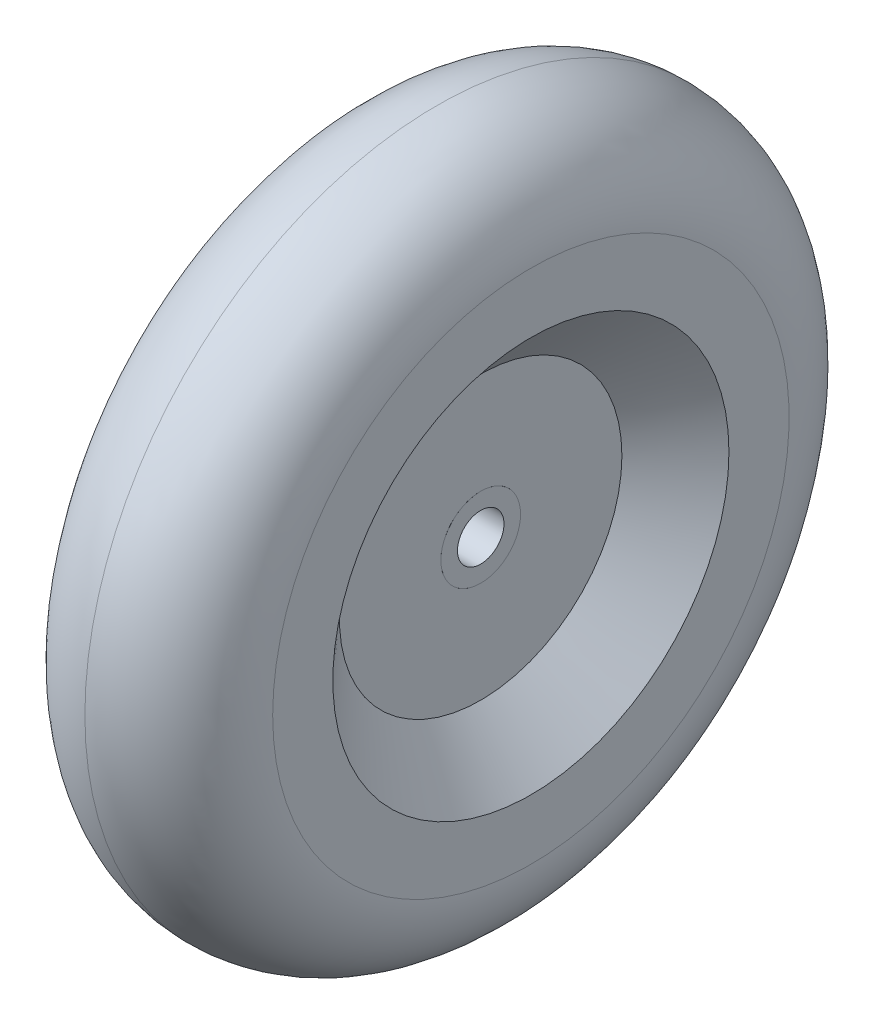
ISO-10303-21;
HEADER;
FILE_DESCRIPTION(('STEP AP214'),'2;1');
FILE_NAME('part.step','',(''),(''),'','','');
FILE_SCHEMA(('AUTOMOTIVE_DESIGN { 1 0 10303 214 1 1 1 1 }'));
ENDSEC;
DATA;
#1=APPLICATION_CONTEXT('core data for automotive mechanical design processes');
#2=APPLICATION_PROTOCOL_DEFINITION('international standard','automotive_design',2000,#1);
#3=PRODUCT_CONTEXT('',#1,'mechanical');
#4=PRODUCT('Part','Part','',(#3));
#5=PRODUCT_RELATED_PRODUCT_CATEGORY('part','',(#4));
#6=PRODUCT_DEFINITION_FORMATION('','',#4);
#7=PRODUCT_DEFINITION_CONTEXT('part definition',#1,'design');
#8=PRODUCT_DEFINITION('design','',#6,#7);
#9=PRODUCT_DEFINITION_SHAPE('','',#8);
#10=(LENGTH_UNIT() NAMED_UNIT(*) SI_UNIT(.MILLI.,.METRE.));
#11=(NAMED_UNIT(*) PLANE_ANGLE_UNIT() SI_UNIT($,.RADIAN.));
#12=(NAMED_UNIT(*) SI_UNIT($,.STERADIAN.) SOLID_ANGLE_UNIT());
#13=UNCERTAINTY_MEASURE_WITH_UNIT(LENGTH_MEASURE(1.E-05),#10,'distance_accuracy_value','');
#14=(GEOMETRIC_REPRESENTATION_CONTEXT(3) GLOBAL_UNCERTAINTY_ASSIGNED_CONTEXT((#13)) GLOBAL_UNIT_ASSIGNED_CONTEXT((#10,
#11,#12)) REPRESENTATION_CONTEXT('',''));
#15=CARTESIAN_POINT('',(0.,0.,0.));
#16=DIRECTION('',(0.,0.,1.));
#17=DIRECTION('',(1.,0.,0.));
#18=AXIS2_PLACEMENT_3D('',#15,#16,#17);
#19=CARTESIAN_POINT('',(226.798142907966,-224.387010818881,-45.));
#20=DIRECTION('',(-1.,0.,0.));
#21=DIRECTION('',(0.,0.,1.));
#22=AXIS2_PLACEMENT_3D('',#19,#20,#21);
#23=CYLINDRICAL_SURFACE('',#22,4.24096034081595);
#24=CARTESIAN_POINT('',(216.793300195848,-224.387010818881,-45.));
#25=DIRECTION('',(-1.,0.,0.));
#26=DIRECTION('',(0.,0.,1.));
#27=AXIS2_PLACEMENT_3D('',#24,#25,#26);
#28=CIRCLE('',#27,4.24096034081595);
#29=CARTESIAN_POINT('',(216.793300195848,-224.387010818881,-40.7590396591841));
#30=VERTEX_POINT('',#29);
#31=EDGE_CURVE('E83',#30,#30,#28,.T.);
#32=ORIENTED_EDGE('',*,*,#31,.F.);
#33=EDGE_LOOP('',(#32));
#34=FACE_BOUND('',#33,.T.);
#35=CARTESIAN_POINT('',(216.798142907966,-224.387010818881,-45.));
#36=DIRECTION('',(1.,0.,0.));
#37=DIRECTION('',(0.,0.,-1.));
#38=AXIS2_PLACEMENT_3D('',#35,#36,#37);
#39=CIRCLE('',#38,4.24096034081595);
#40=CARTESIAN_POINT('',(216.798142907966,-224.387010818881,-49.2409603408159));
#41=VERTEX_POINT('',#40);
#42=EDGE_CURVE('E87',#41,#41,#39,.T.);
#43=ORIENTED_EDGE('',*,*,#42,.F.);
#44=EDGE_LOOP('',(#43));
#45=FACE_BOUND('',#44,.T.);
#46=ADVANCED_FACE('F51',(#34,#45),#23,.T.);
#47=CARTESIAN_POINT('',(207.268142907966,-220.146050478065,-45.));
#48=DIRECTION('',(1.,0.,0.));
#49=DIRECTION('',(0.,0.,-1.));
#50=AXIS2_PLACEMENT_3D('',#47,#48,#49);
#51=PLANE('',#50);
#52=CARTESIAN_POINT('',(207.268142907966,-224.387010818881,-45.));
#53=DIRECTION('',(1.,0.,0.));
#54=DIRECTION('',(0.,0.,-1.));
#55=AXIS2_PLACEMENT_3D('',#52,#53,#54);
#56=CIRCLE('',#55,2.475);
#57=CARTESIAN_POINT('',(207.268142907966,-224.387010818881,-47.475));
#58=VERTEX_POINT('',#57);
#59=EDGE_CURVE('E91',#58,#58,#56,.T.);
#60=ORIENTED_EDGE('',*,*,#59,.T.);
#61=EDGE_LOOP('',(#60));
#62=FACE_BOUND('',#61,.T.);
#63=CARTESIAN_POINT('',(207.268142907966,-224.387010818881,-45.));
#64=DIRECTION('',(1.,0.,0.));
#65=DIRECTION('',(0.,0.,-1.));
#66=AXIS2_PLACEMENT_3D('',#63,#64,#65);
#67=CIRCLE('',#66,14.5422249917012);
#68=CARTESIAN_POINT('',(207.268142907966,-224.387010818881,-59.5422249917012));
#69=VERTEX_POINT('',#68);
#70=EDGE_CURVE('E65',#69,#69,#67,.T.);
#71=ORIENTED_EDGE('',*,*,#70,.F.);
#72=EDGE_LOOP('',(#71));
#73=FACE_BOUND('',#72,.T.);
#74=ADVANCED_FACE('F111',(#62,#73),#51,.F.);
#75=CARTESIAN_POINT('',(207.268142907966,-224.387010818881,-45.));
#76=DIRECTION('',(-1.,0.,0.));
#77=DIRECTION('',(0.,0.,1.));
#78=AXIS2_PLACEMENT_3D('',#75,#76,#77);
#79=CONICAL_SURFACE('',#78,14.5422249917012,0.723851281054418);
#80=CARTESIAN_POINT('',(202.142042365197,-224.387010818881,-45.));
#81=DIRECTION('',(1.,0.,0.));
#82=DIRECTION('',(0.,0.,-1.));
#83=AXIS2_PLACEMENT_3D('',#80,#81,#82);
#84=CIRCLE('',#83,19.0732103774336);
#85=CARTESIAN_POINT('',(202.142042365197,-224.387010818881,-64.0732103774336));
#86=VERTEX_POINT('',#85);
#87=EDGE_CURVE('E71',#86,#86,#84,.T.);
#88=ORIENTED_EDGE('',*,*,#87,.F.);
#89=EDGE_LOOP('',(#88));
#90=FACE_BOUND('',#89,.T.);
#91=ORIENTED_EDGE('',*,*,#70,.T.);
#92=EDGE_LOOP('',(#91));
#93=FACE_BOUND('',#92,.T.);
#94=ADVANCED_FACE('F118',(#90,#93),#79,.F.);
#95=CARTESIAN_POINT('',(202.142042365197,-205.313800441447,-45.));
#96=DIRECTION('',(1.,0.,0.));
#97=DIRECTION('',(0.,0.,-1.));
#98=AXIS2_PLACEMENT_3D('',#95,#96,#97);
#99=PLANE('',#98);
#100=CARTESIAN_POINT('',(202.142042365197,-224.387010818881,-45.));
#101=DIRECTION('',(1.,0.,0.));
#102=DIRECTION('',(0.,0.,-1.));
#103=AXIS2_PLACEMENT_3D('',#100,#101,#102);
#104=CIRCLE('',#103,27.5);
#105=CARTESIAN_POINT('',(202.142042365197,-224.387010818881,-72.5));
#106=VERTEX_POINT('',#105);
#107=EDGE_CURVE('E60',#106,#106,#104,.F.);
#108=ORIENTED_EDGE('',*,*,#107,.T.);
#109=EDGE_LOOP('',(#108));
#110=FACE_BOUND('',#109,.T.);
#111=ORIENTED_EDGE('',*,*,#87,.T.);
#112=EDGE_LOOP('',(#111));
#113=FACE_BOUND('',#112,.T.);
#114=ADVANCED_FACE('F134',(#110,#113),#99,.F.);
#115=CARTESIAN_POINT('',(222.142042365197,-186.887010818881,-45.));
#116=DIRECTION('',(-1.,0.,0.));
#117=DIRECTION('',(0.,0.,1.));
#118=AXIS2_PLACEMENT_3D('',#115,#116,#117);
#119=PLANE('',#118);
#120=CARTESIAN_POINT('',(222.142042365197,-224.387010818881,-45.));
#121=DIRECTION('',(-1.,0.,0.));
#122=DIRECTION('',(0.,0.,1.));
#123=AXIS2_PLACEMENT_3D('',#120,#121,#122);
#124=CIRCLE('',#123,27.5);
#125=CARTESIAN_POINT('',(222.142042365197,-224.387010818881,-17.5));
#126=VERTEX_POINT('',#125);
#127=EDGE_CURVE('E10',#126,#126,#124,.F.);
#128=ORIENTED_EDGE('',*,*,#127,.T.);
#129=EDGE_LOOP('',(#128));
#130=FACE_BOUND('',#129,.T.);
#131=CARTESIAN_POINT('',(222.142042365197,-224.387010818881,-45.));
#132=DIRECTION('',(1.,0.,0.));
#133=DIRECTION('',(0.,0.,-1.));
#134=AXIS2_PLACEMENT_3D('',#131,#132,#133);
#135=CIRCLE('',#134,21.0934892980855);
#136=CARTESIAN_POINT('',(222.142042365197,-224.387010818881,-66.0934892980855));
#137=VERTEX_POINT('',#136);
#138=EDGE_CURVE('E75',#137,#137,#135,.T.);
#139=ORIENTED_EDGE('',*,*,#138,.F.);
#140=EDGE_LOOP('',(#139));
#141=FACE_BOUND('',#140,.T.);
#142=ADVANCED_FACE('F130',(#130,#141),#119,.F.);
#143=CARTESIAN_POINT('',(222.142042365197,-224.387010818881,-45.));
#144=DIRECTION('',(1.,0.,0.));
#145=DIRECTION('',(0.,0.,-1.));
#146=AXIS2_PLACEMENT_3D('',#143,#144,#145);
#147=CONICAL_SURFACE('',#146,21.0934892980855,0.846945045740481);
#148=CARTESIAN_POINT('',(216.793300195848,-224.387010818881,-45.));
#149=DIRECTION('',(1.,0.,0.));
#150=DIRECTION('',(0.,0.,-1.));
#151=AXIS2_PLACEMENT_3D('',#148,#149,#150);
#152=CIRCLE('',#151,15.0422249917012);
#153=CARTESIAN_POINT('',(216.793300195848,-224.387010818881,-60.0422249917012));
#154=VERTEX_POINT('',#153);
#155=EDGE_CURVE('E79',#154,#154,#152,.T.);
#156=ORIENTED_EDGE('',*,*,#155,.F.);
#157=EDGE_LOOP('',(#156));
#158=FACE_BOUND('',#157,.T.);
#159=ORIENTED_EDGE('',*,*,#138,.T.);
#160=EDGE_LOOP('',(#159));
#161=FACE_BOUND('',#160,.T.);
#162=ADVANCED_FACE('F126',(#158,#161),#147,.F.);
#163=CARTESIAN_POINT('',(216.793300195848,-209.34478582718,-45.));
#164=DIRECTION('',(-1.,0.,0.));
#165=DIRECTION('',(0.,0.,1.));
#166=AXIS2_PLACEMENT_3D('',#163,#164,#165);
#167=PLANE('',#166);
#168=ORIENTED_EDGE('',*,*,#31,.T.);
#169=EDGE_LOOP('',(#168));
#170=FACE_BOUND('',#169,.T.);
#171=ORIENTED_EDGE('',*,*,#155,.T.);
#172=EDGE_LOOP('',(#171));
#173=FACE_BOUND('',#172,.T.);
#174=ADVANCED_FACE('F124',(#170,#173),#167,.F.);
#175=CARTESIAN_POINT('',(212.142042365197,-224.387010818881,-45.));
#176=DIRECTION('',(-1.,0.,0.));
#177=DIRECTION('',(0.,0.,1.));
#178=AXIS2_PLACEMENT_3D('',#175,#176,#177);
#179=TOROIDAL_SURFACE('',#178,27.5,10.);
#180=ORIENTED_EDGE('',*,*,#127,.F.);
#181=EDGE_LOOP('',(#180));
#182=FACE_BOUND('',#181,.T.);
#183=CARTESIAN_POINT('',(212.142042365197,-224.387010818881,-45.));
#184=DIRECTION('',(-1.,0.,0.));
#185=DIRECTION('',(0.,0.,1.));
#186=AXIS2_PLACEMENT_3D('',#183,#184,#185);
#187=CIRCLE('',#186,37.5);
#188=CARTESIAN_POINT('',(212.142042365197,-224.387010818881,-7.49999999999999));
#189=VERTEX_POINT('',#188);
#190=EDGE_CURVE('E55',#189,#189,#187,.T.);
#191=ORIENTED_EDGE('',*,*,#190,.F.);
#192=EDGE_LOOP('',(#191));
#193=FACE_BOUND('',#192,.T.);
#194=ADVANCED_FACE('F53',(#182,#193),#179,.T.);
#195=CARTESIAN_POINT('',(212.142042365197,-224.387010818881,-45.));
#196=DIRECTION('',(1.,0.,0.));
#197=DIRECTION('',(0.,0.,-1.));
#198=AXIS2_PLACEMENT_3D('',#195,#196,#197);
#199=TOROIDAL_SURFACE('',#198,27.5,10.);
#200=ORIENTED_EDGE('',*,*,#107,.F.);
#201=EDGE_LOOP('',(#200));
#202=FACE_BOUND('',#201,.T.);
#203=ORIENTED_EDGE('',*,*,#190,.T.);
#204=EDGE_LOOP('',(#203));
#205=FACE_BOUND('',#204,.T.);
#206=ADVANCED_FACE('F106',(#202,#205),#199,.T.);
#207=CARTESIAN_POINT('',(216.798142907966,-224.387010818881,-45.));
#208=DIRECTION('',(1.,0.,0.));
#209=DIRECTION('',(0.,0.,-1.));
#210=AXIS2_PLACEMENT_3D('',#207,#208,#209);
#211=PLANE('',#210);
#212=CARTESIAN_POINT('',(216.798142907966,-224.387010818881,-45.));
#213=DIRECTION('',(1.,0.,0.));
#214=DIRECTION('',(0.,0.,-1.));
#215=AXIS2_PLACEMENT_3D('',#212,#213,#214);
#216=CIRCLE('',#215,2.475);
#217=CARTESIAN_POINT('',(216.798142907966,-224.387010818881,-47.475));
#218=VERTEX_POINT('',#217);
#219=EDGE_CURVE('E95',#218,#218,#216,.T.);
#220=ORIENTED_EDGE('',*,*,#219,.F.);
#221=EDGE_LOOP('',(#220));
#222=FACE_BOUND('',#221,.T.);
#223=ORIENTED_EDGE('',*,*,#42,.T.);
#224=EDGE_LOOP('',(#223));
#225=FACE_BOUND('',#224,.T.);
#226=ADVANCED_FACE('F103',(#222,#225),#211,.T.);
#227=CARTESIAN_POINT('',(201.798142907966,-224.387010818881,-45.));
#228=DIRECTION('',(1.,0.,0.));
#229=DIRECTION('',(0.,0.,-1.));
#230=AXIS2_PLACEMENT_3D('',#227,#228,#229);
#231=CYLINDRICAL_SURFACE('',#230,2.475);
#232=ORIENTED_EDGE('',*,*,#219,.T.);
#233=EDGE_LOOP('',(#232));
#234=FACE_BOUND('',#233,.T.);
#235=ORIENTED_EDGE('',*,*,#59,.F.);
#236=EDGE_LOOP('',(#235));
#237=FACE_BOUND('',#236,.T.);
#238=ADVANCED_FACE('F100',(#234,#237),#231,.F.);
#239=CLOSED_SHELL('',(#46,#74,#94,#114,#142,#162,#174,#194,#206,#226,#238));
#240=MANIFOLD_SOLID_BREP('B2',#239);
#241=ADVANCED_BREP_SHAPE_REPRESENTATION('',(#18,#240),#14);
#242=SHAPE_DEFINITION_REPRESENTATION(#9,#241);
ENDSEC;
END-ISO-10303-21;
